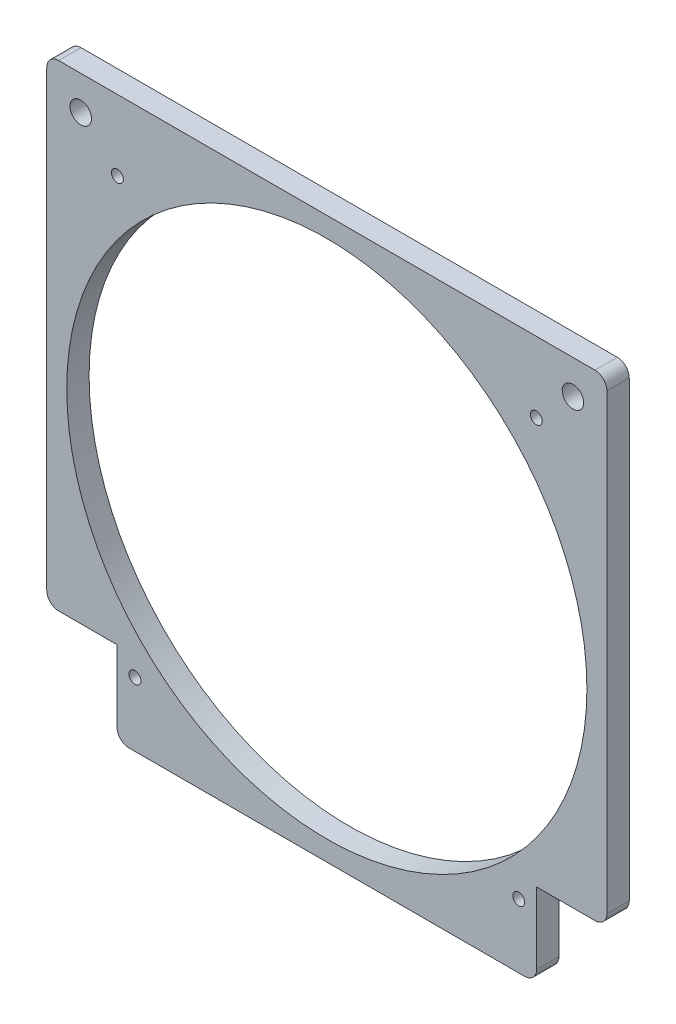
ISO-10303-21;
HEADER;
FILE_DESCRIPTION(('STEP AP214'),'2;1');
FILE_NAME('part.step','',(''),(''),'','','');
FILE_SCHEMA(('AUTOMOTIVE_DESIGN { 1 0 10303 214 1 1 1 1 }'));
ENDSEC;
DATA;
#1=APPLICATION_CONTEXT('core data for automotive mechanical design processes');
#2=APPLICATION_PROTOCOL_DEFINITION('international standard','automotive_design',2000,#1);
#3=PRODUCT_CONTEXT('',#1,'mechanical');
#4=PRODUCT('Part','Part','',(#3));
#5=PRODUCT_RELATED_PRODUCT_CATEGORY('part','',(#4));
#6=PRODUCT_DEFINITION_FORMATION('','',#4);
#7=PRODUCT_DEFINITION_CONTEXT('part definition',#1,'design');
#8=PRODUCT_DEFINITION('design','',#6,#7);
#9=PRODUCT_DEFINITION_SHAPE('','',#8);
#10=(LENGTH_UNIT() NAMED_UNIT(*) SI_UNIT(.MILLI.,.METRE.));
#11=(NAMED_UNIT(*) PLANE_ANGLE_UNIT() SI_UNIT($,.RADIAN.));
#12=(NAMED_UNIT(*) SI_UNIT($,.STERADIAN.) SOLID_ANGLE_UNIT());
#13=UNCERTAINTY_MEASURE_WITH_UNIT(LENGTH_MEASURE(1.E-05),#10,'distance_accuracy_value','');
#14=(GEOMETRIC_REPRESENTATION_CONTEXT(3) GLOBAL_UNCERTAINTY_ASSIGNED_CONTEXT((#13)) GLOBAL_UNIT_ASSIGNED_CONTEXT((#10,
#11,#12)) REPRESENTATION_CONTEXT('',''));
#15=CARTESIAN_POINT('',(0.,0.,0.));
#16=DIRECTION('',(0.,0.,1.));
#17=DIRECTION('',(1.,0.,0.));
#18=AXIS2_PLACEMENT_3D('',#15,#16,#17);
#19=CARTESIAN_POINT('',(28.4934280897298,92.739217791411,4.7625));
#20=DIRECTION('',(-1.,0.,0.));
#21=DIRECTION('',(0.,-1.,0.));
#22=AXIS2_PLACEMENT_3D('',#19,#20,#21);
#23=PLANE('',#22);
#24=DIRECTION('',(0.,1.,0.));
#25=VECTOR('',#24,1.);
#26=CARTESIAN_POINT('',(28.4934280897298,92.739217791411,4.7625));
#27=LINE('',#26,#25);
#28=CARTESIAN_POINT('',(28.4934280897298,-6.32078220858896,4.7625));
#29=VERTEX_POINT('',#28);
#30=CARTESIAN_POINT('',(28.4934280897298,90.199217791411,4.7625));
#31=VERTEX_POINT('',#30);
#32=EDGE_CURVE('E221',#29,#31,#27,.T.);
#33=ORIENTED_EDGE('',*,*,#32,.F.);
#34=DIRECTION('',(0.,0.,-1.));
#35=VECTOR('',#34,1.);
#36=CARTESIAN_POINT('',(28.4934280897298,-6.32078220858896,4.7625));
#37=LINE('',#36,#35);
#38=CARTESIAN_POINT('',(28.4934280897298,-6.32078220858896,0.));
#39=VERTEX_POINT('',#38);
#40=EDGE_CURVE('E282',#29,#39,#37,.T.);
#41=ORIENTED_EDGE('',*,*,#40,.T.);
#42=DIRECTION('',(0.,1.,0.));
#43=VECTOR('',#42,1.);
#44=CARTESIAN_POINT('',(28.4934280897298,92.739217791411,0.));
#45=LINE('',#44,#43);
#46=CARTESIAN_POINT('',(28.4934280897298,90.199217791411,0.));
#47=VERTEX_POINT('',#46);
#48=EDGE_CURVE('E218',#39,#47,#45,.T.);
#49=ORIENTED_EDGE('',*,*,#48,.T.);
#50=DIRECTION('',(0.,0.,-1.));
#51=VECTOR('',#50,1.);
#52=CARTESIAN_POINT('',(28.4934280897298,90.199217791411,4.7625));
#53=LINE('',#52,#51);
#54=EDGE_CURVE('E257',#47,#31,#53,.F.);
#55=ORIENTED_EDGE('',*,*,#54,.T.);
#56=EDGE_LOOP('',(#33,#41,#49,#55));
#57=FACE_BOUND('',#56,.T.);
#58=ADVANCED_FACE('F34',(#57),#23,.F.);
#59=CARTESIAN_POINT('',(-90.8865719102702,92.739217791411,4.7625));
#60=DIRECTION('',(0.,-1.,0.));
#61=DIRECTION('',(0.,0.,-1.));
#62=AXIS2_PLACEMENT_3D('',#59,#60,#61);
#63=PLANE('',#62);
#64=DIRECTION('',(-1.,0.,0.));
#65=VECTOR('',#64,1.);
#66=CARTESIAN_POINT('',(-90.8865719102702,92.739217791411,0.));
#67=LINE('',#66,#65);
#68=CARTESIAN_POINT('',(25.9534280897298,92.739217791411,0.));
#69=VERTEX_POINT('',#68);
#70=CARTESIAN_POINT('',(-88.3465719102702,92.739217791411,0.));
#71=VERTEX_POINT('',#70);
#72=EDGE_CURVE('E233',#69,#71,#67,.T.);
#73=ORIENTED_EDGE('',*,*,#72,.T.);
#74=DIRECTION('',(0.,0.,-1.));
#75=VECTOR('',#74,1.);
#76=CARTESIAN_POINT('',(-88.3465719102702,92.739217791411,4.7625));
#77=LINE('',#76,#75);
#78=CARTESIAN_POINT('',(-88.3465719102702,92.739217791411,4.7625));
#79=VERTEX_POINT('',#78);
#80=EDGE_CURVE('E251',#71,#79,#77,.F.);
#81=ORIENTED_EDGE('',*,*,#80,.T.);
#82=DIRECTION('',(-1.,0.,0.));
#83=VECTOR('',#82,1.);
#84=CARTESIAN_POINT('',(-90.8865719102702,92.739217791411,4.7625));
#85=LINE('',#84,#83);
#86=CARTESIAN_POINT('',(25.9534280897298,92.739217791411,4.7625));
#87=VERTEX_POINT('',#86);
#88=EDGE_CURVE('E223',#87,#79,#85,.T.);
#89=ORIENTED_EDGE('',*,*,#88,.F.);
#90=DIRECTION('',(0.,0.,-1.));
#91=VECTOR('',#90,1.);
#92=CARTESIAN_POINT('',(25.9534280897298,92.739217791411,4.7625));
#93=LINE('',#92,#91);
#94=EDGE_CURVE('E248',#87,#69,#93,.T.);
#95=ORIENTED_EDGE('',*,*,#94,.T.);
#96=EDGE_LOOP('',(#73,#81,#89,#95));
#97=FACE_BOUND('',#96,.T.);
#98=ADVANCED_FACE('F321',(#97),#63,.F.);
#99=CARTESIAN_POINT('',(-90.8865719102702,92.739217791411,4.7625));
#100=DIRECTION('',(1.,0.,0.));
#101=DIRECTION('',(0.,1.,0.));
#102=AXIS2_PLACEMENT_3D('',#99,#100,#101);
#103=PLANE('',#102);
#104=DIRECTION('',(0.,-1.,0.));
#105=VECTOR('',#104,1.);
#106=CARTESIAN_POINT('',(-90.8865719102702,92.739217791411,0.));
#107=LINE('',#106,#105);
#108=CARTESIAN_POINT('',(-90.8865719102702,90.199217791411,0.));
#109=VERTEX_POINT('',#108);
#110=CARTESIAN_POINT('',(-90.8865719102702,-6.32078220858896,0.));
#111=VERTEX_POINT('',#110);
#112=EDGE_CURVE('E236',#109,#111,#107,.T.);
#113=ORIENTED_EDGE('',*,*,#112,.T.);
#114=DIRECTION('',(0.,0.,-1.));
#115=VECTOR('',#114,1.);
#116=CARTESIAN_POINT('',(-90.8865719102702,-6.32078220858896,4.7625));
#117=LINE('',#116,#115);
#118=CARTESIAN_POINT('',(-90.8865719102702,-6.32078220858896,4.7625));
#119=VERTEX_POINT('',#118);
#120=EDGE_CURVE('E11',#111,#119,#117,.F.);
#121=ORIENTED_EDGE('',*,*,#120,.T.);
#122=DIRECTION('',(0.,-1.,0.));
#123=VECTOR('',#122,1.);
#124=CARTESIAN_POINT('',(-90.8865719102702,92.739217791411,4.7625));
#125=LINE('',#124,#123);
#126=CARTESIAN_POINT('',(-90.8865719102702,90.199217791411,4.7625));
#127=VERTEX_POINT('',#126);
#128=EDGE_CURVE('E227',#127,#119,#125,.T.);
#129=ORIENTED_EDGE('',*,*,#128,.F.);
#130=DIRECTION('',(0.,0.,-1.));
#131=VECTOR('',#130,1.);
#132=CARTESIAN_POINT('',(-90.8865719102702,90.199217791411,4.7625));
#133=LINE('',#132,#131);
#134=EDGE_CURVE('E231',#127,#109,#133,.T.);
#135=ORIENTED_EDGE('',*,*,#134,.T.);
#136=EDGE_LOOP('',(#113,#121,#129,#135));
#137=FACE_BOUND('',#136,.T.);
#138=ADVANCED_FACE('F330',(#137),#103,.F.);
#139=CARTESIAN_POINT('',(-90.8865719102702,-26.640782208589,4.7625));
#140=DIRECTION('',(0.,1.,0.));
#141=DIRECTION('',(0.,0.,1.));
#142=AXIS2_PLACEMENT_3D('',#139,#140,#141);
#143=PLANE('',#142);
#144=DIRECTION('',(1.,0.,0.));
#145=VECTOR('',#144,1.);
#146=CARTESIAN_POINT('',(-90.8865719102702,-26.640782208589,0.));
#147=LINE('',#146,#145);
#148=CARTESIAN_POINT('',(-73.3605719102702,-26.640782208589,0.));
#149=VERTEX_POINT('',#148);
#150=CARTESIAN_POINT('',(10.9674280897298,-26.640782208589,0.));
#151=VERTEX_POINT('',#150);
#152=EDGE_CURVE('E224',#149,#151,#147,.T.);
#153=ORIENTED_EDGE('',*,*,#152,.T.);
#154=DIRECTION('',(0.,0.,-1.));
#155=VECTOR('',#154,1.);
#156=CARTESIAN_POINT('',(10.9674280897298,-26.640782208589,4.7625));
#157=LINE('',#156,#155);
#158=CARTESIAN_POINT('',(10.9674280897298,-26.640782208589,4.7625));
#159=VERTEX_POINT('',#158);
#160=EDGE_CURVE('E274',#151,#159,#157,.F.);
#161=ORIENTED_EDGE('',*,*,#160,.T.);
#162=DIRECTION('',(1.,0.,0.));
#163=VECTOR('',#162,1.);
#164=CARTESIAN_POINT('',(-90.8865719102702,-26.640782208589,4.7625));
#165=LINE('',#164,#163);
#166=CARTESIAN_POINT('',(-73.3605719102702,-26.640782208589,4.7625));
#167=VERTEX_POINT('',#166);
#168=EDGE_CURVE('E229',#167,#159,#165,.T.);
#169=ORIENTED_EDGE('',*,*,#168,.F.);
#170=DIRECTION('',(0.,0.,-1.));
#171=VECTOR('',#170,1.);
#172=CARTESIAN_POINT('',(-73.3605719102702,-26.640782208589,4.7625));
#173=LINE('',#172,#171);
#174=EDGE_CURVE('E271',#167,#149,#173,.T.);
#175=ORIENTED_EDGE('',*,*,#174,.T.);
#176=EDGE_LOOP('',(#153,#161,#169,#175));
#177=FACE_BOUND('',#176,.T.);
#178=ADVANCED_FACE('F298',(#177),#143,.F.);
#179=CARTESIAN_POINT('',(0.,0.,4.7625));
#180=DIRECTION('',(0.,0.,1.));
#181=DIRECTION('',(1.,0.,0.));
#182=AXIS2_PLACEMENT_3D('',#179,#180,#181);
#183=PLANE('',#182);
#184=ORIENTED_EDGE('',*,*,#168,.T.);
#185=CARTESIAN_POINT('',(10.9674280897298,-24.100782208589,4.7625));
#186=DIRECTION('',(0.,0.,1.));
#187=DIRECTION('',(1.,0.,0.));
#188=AXIS2_PLACEMENT_3D('',#185,#186,#187);
#189=CIRCLE('',#188,2.54);
#190=CARTESIAN_POINT('',(13.5074280897298,-24.100782208589,4.7625));
#191=VERTEX_POINT('',#190);
#192=EDGE_CURVE('E280',#159,#191,#189,.T.);
#193=ORIENTED_EDGE('',*,*,#192,.T.);
#194=DIRECTION('',(0.,1.,0.));
#195=VECTOR('',#194,1.);
#196=CARTESIAN_POINT('',(13.5074280897298,-26.640782208589,4.7625));
#197=LINE('',#196,#195);
#198=CARTESIAN_POINT('',(13.5074280897298,-8.86078220858896,4.7625));
#199=VERTEX_POINT('',#198);
#200=EDGE_CURVE('E162',#191,#199,#197,.T.);
#201=ORIENTED_EDGE('',*,*,#200,.T.);
#202=DIRECTION('',(1.,0.,0.));
#203=VECTOR('',#202,1.);
#204=CARTESIAN_POINT('',(28.4934280897298,-8.86078220858896,4.7625));
#205=LINE('',#204,#203);
#206=CARTESIAN_POINT('',(25.9534280897298,-8.86078220858896,4.7625));
#207=VERTEX_POINT('',#206);
#208=EDGE_CURVE('E165',#199,#207,#205,.T.);
#209=ORIENTED_EDGE('',*,*,#208,.T.);
#210=CARTESIAN_POINT('',(25.9534280897298,-6.32078220858896,4.7625));
#211=DIRECTION('',(0.,0.,1.));
#212=DIRECTION('',(1.,0.,0.));
#213=AXIS2_PLACEMENT_3D('',#210,#211,#212);
#214=CIRCLE('',#213,2.54);
#215=EDGE_CURVE('E49',#207,#29,#214,.T.);
#216=ORIENTED_EDGE('',*,*,#215,.T.);
#217=ORIENTED_EDGE('',*,*,#32,.T.);
#218=CARTESIAN_POINT('',(25.9534280897298,90.199217791411,4.7625));
#219=DIRECTION('',(0.,0.,1.));
#220=DIRECTION('',(1.,0.,0.));
#221=AXIS2_PLACEMENT_3D('',#218,#219,#220);
#222=CIRCLE('',#221,2.54);
#223=EDGE_CURVE('E253',#31,#87,#222,.T.);
#224=ORIENTED_EDGE('',*,*,#223,.T.);
#225=ORIENTED_EDGE('',*,*,#88,.T.);
#226=CARTESIAN_POINT('',(-88.3465719102702,90.199217791411,4.7625));
#227=DIRECTION('',(0.,0.,1.));
#228=DIRECTION('',(1.,0.,0.));
#229=AXIS2_PLACEMENT_3D('',#226,#227,#228);
#230=CIRCLE('',#229,2.54);
#231=EDGE_CURVE('E255',#79,#127,#230,.T.);
#232=ORIENTED_EDGE('',*,*,#231,.T.);
#233=ORIENTED_EDGE('',*,*,#128,.T.);
#234=CARTESIAN_POINT('',(-88.3465719102702,-6.32078220858896,4.7625));
#235=DIRECTION('',(0.,0.,1.));
#236=DIRECTION('',(1.,0.,0.));
#237=AXIS2_PLACEMENT_3D('',#234,#235,#236);
#238=CIRCLE('',#237,2.54);
#239=CARTESIAN_POINT('',(-88.3465719102702,-8.86078220858896,4.7625));
#240=VERTEX_POINT('',#239);
#241=EDGE_CURVE('E144',#119,#240,#238,.T.);
#242=ORIENTED_EDGE('',*,*,#241,.T.);
#243=DIRECTION('',(1.,0.,0.));
#244=VECTOR('',#243,1.);
#245=CARTESIAN_POINT('',(-90.8865719102702,-8.86078220858896,4.7625));
#246=LINE('',#245,#244);
#247=CARTESIAN_POINT('',(-75.9005719102702,-8.86078220858896,4.7625));
#248=VERTEX_POINT('',#247);
#249=EDGE_CURVE('E135',#240,#248,#246,.T.);
#250=ORIENTED_EDGE('',*,*,#249,.T.);
#251=DIRECTION('',(0.,-1.,0.));
#252=VECTOR('',#251,1.);
#253=CARTESIAN_POINT('',(-75.9005719102702,-26.640782208589,4.7625));
#254=LINE('',#253,#252);
#255=CARTESIAN_POINT('',(-75.9005719102702,-24.100782208589,4.7625));
#256=VERTEX_POINT('',#255);
#257=EDGE_CURVE('E140',#248,#256,#254,.T.);
#258=ORIENTED_EDGE('',*,*,#257,.T.);
#259=CARTESIAN_POINT('',(-73.3605719102702,-24.100782208589,4.7625));
#260=DIRECTION('',(0.,0.,1.));
#261=DIRECTION('',(1.,0.,0.));
#262=AXIS2_PLACEMENT_3D('',#259,#260,#261);
#263=CIRCLE('',#262,2.54);
#264=EDGE_CURVE('E277',#256,#167,#263,.T.);
#265=ORIENTED_EDGE('',*,*,#264,.T.);
#266=EDGE_LOOP('',(#184,#193,#201,#209,#216,#217,#224,#225,#232,#233,#242,#250,#258,#265));
#267=FACE_BOUND('',#266,.T.);
#268=CARTESIAN_POINT('',(-72.0905719102702,-12.9882822085891,4.7625));
#269=DIRECTION('',(0.,0.,1.));
#270=DIRECTION('',(1.,0.,0.));
#271=AXIS2_PLACEMENT_3D('',#268,#269,#270);
#272=CIRCLE('',#271,1.27000000000001);
#273=CARTESIAN_POINT('',(-70.8205719102702,-12.9882822085891,4.7625));
#274=VERTEX_POINT('',#273);
#275=EDGE_CURVE('E178',#274,#274,#272,.F.);
#276=ORIENTED_EDGE('',*,*,#275,.T.);
#277=EDGE_LOOP('',(#276));
#278=FACE_BOUND('',#277,.T.);
#279=CARTESIAN_POINT('',(9.6974280897298,-12.9882822085891,4.7625));
#280=DIRECTION('',(0.,0.,1.));
#281=DIRECTION('',(1.,0.,0.));
#282=AXIS2_PLACEMENT_3D('',#279,#280,#281);
#283=CIRCLE('',#282,1.27);
#284=CARTESIAN_POINT('',(10.9674280897298,-12.9882822085891,4.7625));
#285=VERTEX_POINT('',#284);
#286=EDGE_CURVE('E189',#285,#285,#283,.F.);
#287=ORIENTED_EDGE('',*,*,#286,.T.);
#288=EDGE_LOOP('',(#287));
#289=FACE_BOUND('',#288,.T.);
#290=CARTESIAN_POINT('',(-75.8370719102702,77.689717791411,4.7625));
#291=DIRECTION('',(0.,0.,1.));
#292=DIRECTION('',(1.,0.,0.));
#293=AXIS2_PLACEMENT_3D('',#290,#291,#292);
#294=CIRCLE('',#293,1.26999999999999);
#295=CARTESIAN_POINT('',(-74.5670719102702,77.689717791411,4.7625));
#296=VERTEX_POINT('',#295);
#297=EDGE_CURVE('E183',#296,#296,#294,.F.);
#298=ORIENTED_EDGE('',*,*,#297,.T.);
#299=EDGE_LOOP('',(#298));
#300=FACE_BOUND('',#299,.T.);
#301=CARTESIAN_POINT('',(-83.6475719102702,85.500217791411,4.7625));
#302=DIRECTION('',(0.,0.,1.));
#303=DIRECTION('',(1.,0.,0.));
#304=AXIS2_PLACEMENT_3D('',#301,#302,#303);
#305=CIRCLE('',#304,2.28599999999999);
#306=CARTESIAN_POINT('',(-81.3615719102702,85.500217791411,4.7625));
#307=VERTEX_POINT('',#306);
#308=EDGE_CURVE('E206',#307,#307,#305,.F.);
#309=ORIENTED_EDGE('',*,*,#308,.T.);
#310=EDGE_LOOP('',(#309));
#311=FACE_BOUND('',#310,.T.);
#312=CARTESIAN_POINT('',(13.4439280897298,77.6897177914109,4.7625));
#313=DIRECTION('',(0.,0.,1.));
#314=DIRECTION('',(1.,0.,0.));
#315=AXIS2_PLACEMENT_3D('',#312,#313,#314);
#316=CIRCLE('',#315,1.27);
#317=CARTESIAN_POINT('',(14.7139280897298,77.6897177914109,4.7625));
#318=VERTEX_POINT('',#317);
#319=EDGE_CURVE('E182',#318,#318,#316,.F.);
#320=ORIENTED_EDGE('',*,*,#319,.T.);
#321=EDGE_LOOP('',(#320));
#322=FACE_BOUND('',#321,.T.);
#323=CARTESIAN_POINT('',(-31.1965719102702,33.049217791411,4.7625));
#324=DIRECTION('',(0.,0.,1.));
#325=DIRECTION('',(1.,0.,0.));
#326=AXIS2_PLACEMENT_3D('',#323,#324,#325);
#327=CIRCLE('',#326,55.4291226302911);
#328=CARTESIAN_POINT('',(24.2325507200209,33.049217791411,4.7625));
#329=VERTEX_POINT('',#328);
#330=EDGE_CURVE('E200',#329,#329,#327,.F.);
#331=ORIENTED_EDGE('',*,*,#330,.T.);
#332=EDGE_LOOP('',(#331));
#333=FACE_BOUND('',#332,.T.);
#334=CARTESIAN_POINT('',(21.2544280897298,85.500217791411,4.7625));
#335=DIRECTION('',(0.,0.,1.));
#336=DIRECTION('',(1.,0.,0.));
#337=AXIS2_PLACEMENT_3D('',#334,#335,#336);
#338=CIRCLE('',#337,2.286);
#339=CARTESIAN_POINT('',(23.5404280897298,85.500217791411,4.7625));
#340=VERTEX_POINT('',#339);
#341=EDGE_CURVE('E212',#340,#340,#338,.F.);
#342=ORIENTED_EDGE('',*,*,#341,.T.);
#343=EDGE_LOOP('',(#342));
#344=FACE_BOUND('',#343,.T.);
#345=ADVANCED_FACE('F138',(#267,#278,#289,#300,#311,#322,#333,#344),#183,.T.);
#346=CARTESIAN_POINT('',(0.,0.,0.));
#347=DIRECTION('',(0.,0.,1.));
#348=DIRECTION('',(1.,0.,0.));
#349=AXIS2_PLACEMENT_3D('',#346,#347,#348);
#350=PLANE('',#349);
#351=CARTESIAN_POINT('',(-72.0905719102702,-12.9882822085891,0.));
#352=DIRECTION('',(0.,0.,-1.));
#353=DIRECTION('',(1.,0.,0.));
#354=AXIS2_PLACEMENT_3D('',#351,#352,#353);
#355=CIRCLE('',#354,1.27000000000001);
#356=CARTESIAN_POINT('',(-70.8205719102702,-12.9882822085891,0.));
#357=VERTEX_POINT('',#356);
#358=EDGE_CURVE('E192',#357,#357,#355,.T.);
#359=ORIENTED_EDGE('',*,*,#358,.F.);
#360=EDGE_LOOP('',(#359));
#361=FACE_BOUND('',#360,.T.);
#362=CARTESIAN_POINT('',(9.6974280897298,-12.9882822085891,0.));
#363=DIRECTION('',(0.,0.,-1.));
#364=DIRECTION('',(-1.,0.,0.));
#365=AXIS2_PLACEMENT_3D('',#362,#363,#364);
#366=CIRCLE('',#365,1.27);
#367=CARTESIAN_POINT('',(8.4274280897298,-12.9882822085891,0.));
#368=VERTEX_POINT('',#367);
#369=EDGE_CURVE('E186',#368,#368,#366,.T.);
#370=ORIENTED_EDGE('',*,*,#369,.F.);
#371=EDGE_LOOP('',(#370));
#372=FACE_BOUND('',#371,.T.);
#373=CARTESIAN_POINT('',(-75.8370719102702,77.689717791411,0.));
#374=DIRECTION('',(0.,0.,-1.));
#375=DIRECTION('',(1.,0.,0.));
#376=AXIS2_PLACEMENT_3D('',#373,#374,#375);
#377=CIRCLE('',#376,1.26999999999999);
#378=CARTESIAN_POINT('',(-74.5670719102702,77.689717791411,0.));
#379=VERTEX_POINT('',#378);
#380=EDGE_CURVE('E179',#379,#379,#377,.T.);
#381=ORIENTED_EDGE('',*,*,#380,.F.);
#382=EDGE_LOOP('',(#381));
#383=FACE_BOUND('',#382,.T.);
#384=CARTESIAN_POINT('',(-83.6475719102702,85.500217791411,0.));
#385=DIRECTION('',(0.,0.,-1.));
#386=DIRECTION('',(-1.,0.,0.));
#387=AXIS2_PLACEMENT_3D('',#384,#385,#386);
#388=CIRCLE('',#387,2.28599999999999);
#389=CARTESIAN_POINT('',(-85.9335719102702,85.500217791411,0.));
#390=VERTEX_POINT('',#389);
#391=EDGE_CURVE('E209',#390,#390,#388,.T.);
#392=ORIENTED_EDGE('',*,*,#391,.F.);
#393=EDGE_LOOP('',(#392));
#394=FACE_BOUND('',#393,.T.);
#395=CARTESIAN_POINT('',(13.4439280897298,77.6897177914109,0.));
#396=DIRECTION('',(0.,0.,-1.));
#397=DIRECTION('',(-1.,0.,0.));
#398=AXIS2_PLACEMENT_3D('',#395,#396,#397);
#399=CIRCLE('',#398,1.27);
#400=CARTESIAN_POINT('',(12.1739280897298,77.6897177914109,0.));
#401=VERTEX_POINT('',#400);
#402=EDGE_CURVE('E197',#401,#401,#399,.T.);
#403=ORIENTED_EDGE('',*,*,#402,.F.);
#404=EDGE_LOOP('',(#403));
#405=FACE_BOUND('',#404,.T.);
#406=CARTESIAN_POINT('',(-31.1965719102702,33.049217791411,0.));
#407=DIRECTION('',(0.,0.,-1.));
#408=DIRECTION('',(-1.,0.,0.));
#409=AXIS2_PLACEMENT_3D('',#406,#407,#408);
#410=CIRCLE('',#409,55.4291226302911);
#411=CARTESIAN_POINT('',(-86.6256945405613,33.049217791411,0.));
#412=VERTEX_POINT('',#411);
#413=EDGE_CURVE('E203',#412,#412,#410,.T.);
#414=ORIENTED_EDGE('',*,*,#413,.F.);
#415=EDGE_LOOP('',(#414));
#416=FACE_BOUND('',#415,.T.);
#417=CARTESIAN_POINT('',(21.2544280897298,85.500217791411,0.));
#418=DIRECTION('',(0.,0.,-1.));
#419=DIRECTION('',(-1.,0.,0.));
#420=AXIS2_PLACEMENT_3D('',#417,#418,#419);
#421=CIRCLE('',#420,2.286);
#422=CARTESIAN_POINT('',(18.9684280897298,85.500217791411,0.));
#423=VERTEX_POINT('',#422);
#424=EDGE_CURVE('E215',#423,#423,#421,.T.);
#425=ORIENTED_EDGE('',*,*,#424,.F.);
#426=EDGE_LOOP('',(#425));
#427=FACE_BOUND('',#426,.T.);
#428=DIRECTION('',(0.,1.,0.));
#429=VECTOR('',#428,1.);
#430=CARTESIAN_POINT('',(13.5074280897298,-26.640782208589,0.));
#431=LINE('',#430,#429);
#432=CARTESIAN_POINT('',(13.5074280897298,-24.100782208589,0.));
#433=VERTEX_POINT('',#432);
#434=CARTESIAN_POINT('',(13.5074280897298,-8.86078220858896,0.));
#435=VERTEX_POINT('',#434);
#436=EDGE_CURVE('E171',#433,#435,#431,.T.);
#437=ORIENTED_EDGE('',*,*,#436,.F.);
#438=CARTESIAN_POINT('',(10.9674280897298,-24.100782208589,0.));
#439=DIRECTION('',(0.,0.,1.));
#440=DIRECTION('',(1.,0.,0.));
#441=AXIS2_PLACEMENT_3D('',#438,#439,#440);
#442=CIRCLE('',#441,2.54);
#443=EDGE_CURVE('E269',#433,#151,#442,.F.);
#444=ORIENTED_EDGE('',*,*,#443,.T.);
#445=ORIENTED_EDGE('',*,*,#152,.F.);
#446=CARTESIAN_POINT('',(-73.3605719102702,-24.100782208589,0.));
#447=DIRECTION('',(0.,0.,1.));
#448=DIRECTION('',(1.,0.,0.));
#449=AXIS2_PLACEMENT_3D('',#446,#447,#448);
#450=CIRCLE('',#449,2.54);
#451=CARTESIAN_POINT('',(-75.9005719102702,-24.100782208589,0.));
#452=VERTEX_POINT('',#451);
#453=EDGE_CURVE('E265',#149,#452,#450,.F.);
#454=ORIENTED_EDGE('',*,*,#453,.T.);
#455=DIRECTION('',(0.,-1.,0.));
#456=VECTOR('',#455,1.);
#457=CARTESIAN_POINT('',(-75.9005719102702,-26.640782208589,0.));
#458=LINE('',#457,#456);
#459=CARTESIAN_POINT('',(-75.9005719102702,-8.86078220858896,0.));
#460=VERTEX_POINT('',#459);
#461=EDGE_CURVE('E163',#460,#452,#458,.T.);
#462=ORIENTED_EDGE('',*,*,#461,.F.);
#463=DIRECTION('',(1.,0.,0.));
#464=VECTOR('',#463,1.);
#465=CARTESIAN_POINT('',(-90.8865719102702,-8.86078220858896,0.));
#466=LINE('',#465,#464);
#467=CARTESIAN_POINT('',(-88.3465719102702,-8.86078220858896,0.));
#468=VERTEX_POINT('',#467);
#469=EDGE_CURVE('E158',#468,#460,#466,.T.);
#470=ORIENTED_EDGE('',*,*,#469,.F.);
#471=CARTESIAN_POINT('',(-88.3465719102702,-6.32078220858896,0.));
#472=DIRECTION('',(0.,0.,1.));
#473=DIRECTION('',(1.,0.,0.));
#474=AXIS2_PLACEMENT_3D('',#471,#472,#473);
#475=CIRCLE('',#474,2.54);
#476=EDGE_CURVE('E263',#468,#111,#475,.F.);
#477=ORIENTED_EDGE('',*,*,#476,.T.);
#478=ORIENTED_EDGE('',*,*,#112,.F.);
#479=CARTESIAN_POINT('',(-88.3465719102702,90.199217791411,0.));
#480=DIRECTION('',(0.,0.,1.));
#481=DIRECTION('',(1.,0.,0.));
#482=AXIS2_PLACEMENT_3D('',#479,#480,#481);
#483=CIRCLE('',#482,2.54);
#484=EDGE_CURVE('E246',#109,#71,#483,.F.);
#485=ORIENTED_EDGE('',*,*,#484,.T.);
#486=ORIENTED_EDGE('',*,*,#72,.F.);
#487=CARTESIAN_POINT('',(25.9534280897298,90.199217791411,0.));
#488=DIRECTION('',(0.,0.,1.));
#489=DIRECTION('',(1.,0.,0.));
#490=AXIS2_PLACEMENT_3D('',#487,#488,#489);
#491=CIRCLE('',#490,2.54);
#492=EDGE_CURVE('E243',#69,#47,#491,.F.);
#493=ORIENTED_EDGE('',*,*,#492,.T.);
#494=ORIENTED_EDGE('',*,*,#48,.F.);
#495=CARTESIAN_POINT('',(25.9534280897298,-6.32078220858896,0.));
#496=DIRECTION('',(0.,0.,1.));
#497=DIRECTION('',(1.,0.,0.));
#498=AXIS2_PLACEMENT_3D('',#495,#496,#497);
#499=CIRCLE('',#498,2.54);
#500=CARTESIAN_POINT('',(25.9534280897298,-8.86078220858896,0.));
#501=VERTEX_POINT('',#500);
#502=EDGE_CURVE('E267',#39,#501,#499,.F.);
#503=ORIENTED_EDGE('',*,*,#502,.T.);
#504=DIRECTION('',(1.,0.,0.));
#505=VECTOR('',#504,1.);
#506=CARTESIAN_POINT('',(28.4934280897298,-8.86078220858896,0.));
#507=LINE('',#506,#505);
#508=EDGE_CURVE('E173',#435,#501,#507,.T.);
#509=ORIENTED_EDGE('',*,*,#508,.F.);
#510=EDGE_LOOP('',(#437,#444,#445,#454,#462,#470,#477,#478,#485,#486,#493,#494,#503,#509));
#511=FACE_BOUND('',#510,.T.);
#512=ADVANCED_FACE('F289',(#361,#372,#383,#394,#405,#416,#427,#511),#350,.F.);
#513=CARTESIAN_POINT('',(21.2544280897298,85.500217791411,4.7635));
#514=DIRECTION('',(0.,0.,-1.));
#515=DIRECTION('',(-1.,0.,0.));
#516=AXIS2_PLACEMENT_3D('',#513,#514,#515);
#517=CYLINDRICAL_SURFACE('',#516,2.286);
#518=ORIENTED_EDGE('',*,*,#341,.F.);
#519=EDGE_LOOP('',(#518));
#520=FACE_BOUND('',#519,.T.);
#521=ORIENTED_EDGE('',*,*,#424,.T.);
#522=EDGE_LOOP('',(#521));
#523=FACE_BOUND('',#522,.T.);
#524=ADVANCED_FACE('F400',(#520,#523),#517,.F.);
#525=CARTESIAN_POINT('',(-31.1965719102702,33.049217791411,4.7635));
#526=DIRECTION('',(0.,0.,-1.));
#527=DIRECTION('',(-1.,0.,0.));
#528=AXIS2_PLACEMENT_3D('',#525,#526,#527);
#529=CYLINDRICAL_SURFACE('',#528,55.4291226302911);
#530=ORIENTED_EDGE('',*,*,#330,.F.);
#531=EDGE_LOOP('',(#530));
#532=FACE_BOUND('',#531,.T.);
#533=ORIENTED_EDGE('',*,*,#413,.T.);
#534=EDGE_LOOP('',(#533));
#535=FACE_BOUND('',#534,.T.);
#536=ADVANCED_FACE('F529',(#532,#535),#529,.F.);
#537=CARTESIAN_POINT('',(13.4439280897298,77.6897177914109,4.7635));
#538=DIRECTION('',(0.,0.,-1.));
#539=DIRECTION('',(-1.,0.,0.));
#540=AXIS2_PLACEMENT_3D('',#537,#538,#539);
#541=CYLINDRICAL_SURFACE('',#540,1.27);
#542=ORIENTED_EDGE('',*,*,#319,.F.);
#543=EDGE_LOOP('',(#542));
#544=FACE_BOUND('',#543,.T.);
#545=ORIENTED_EDGE('',*,*,#402,.T.);
#546=EDGE_LOOP('',(#545));
#547=FACE_BOUND('',#546,.T.);
#548=ADVANCED_FACE('F519',(#544,#547),#541,.F.);
#549=CARTESIAN_POINT('',(-83.6475719102702,85.500217791411,4.7635));
#550=DIRECTION('',(0.,0.,-1.));
#551=DIRECTION('',(-1.,0.,0.));
#552=AXIS2_PLACEMENT_3D('',#549,#550,#551);
#553=CYLINDRICAL_SURFACE('',#552,2.28599999999999);
#554=ORIENTED_EDGE('',*,*,#308,.F.);
#555=EDGE_LOOP('',(#554));
#556=FACE_BOUND('',#555,.T.);
#557=ORIENTED_EDGE('',*,*,#391,.T.);
#558=EDGE_LOOP('',(#557));
#559=FACE_BOUND('',#558,.T.);
#560=ADVANCED_FACE('F509',(#556,#559),#553,.F.);
#561=CARTESIAN_POINT('',(-75.8370719102702,77.689717791411,4.7635));
#562=DIRECTION('',(0.,0.,-1.));
#563=DIRECTION('',(-1.,0.,0.));
#564=AXIS2_PLACEMENT_3D('',#561,#562,#563);
#565=CYLINDRICAL_SURFACE('',#564,1.26999999999999);
#566=ORIENTED_EDGE('',*,*,#297,.F.);
#567=EDGE_LOOP('',(#566));
#568=FACE_BOUND('',#567,.T.);
#569=ORIENTED_EDGE('',*,*,#380,.T.);
#570=EDGE_LOOP('',(#569));
#571=FACE_BOUND('',#570,.T.);
#572=ADVANCED_FACE('F499',(#568,#571),#565,.F.);
#573=CARTESIAN_POINT('',(9.6974280897298,-12.9882822085891,4.7635));
#574=DIRECTION('',(0.,0.,-1.));
#575=DIRECTION('',(-1.,0.,0.));
#576=AXIS2_PLACEMENT_3D('',#573,#574,#575);
#577=CYLINDRICAL_SURFACE('',#576,1.27);
#578=ORIENTED_EDGE('',*,*,#286,.F.);
#579=EDGE_LOOP('',(#578));
#580=FACE_BOUND('',#579,.T.);
#581=ORIENTED_EDGE('',*,*,#369,.T.);
#582=EDGE_LOOP('',(#581));
#583=FACE_BOUND('',#582,.T.);
#584=ADVANCED_FACE('F489',(#580,#583),#577,.F.);
#585=CARTESIAN_POINT('',(-72.0905719102702,-12.9882822085891,4.7635));
#586=DIRECTION('',(0.,0.,-1.));
#587=DIRECTION('',(-1.,0.,0.));
#588=AXIS2_PLACEMENT_3D('',#585,#586,#587);
#589=CYLINDRICAL_SURFACE('',#588,1.27000000000001);
#590=ORIENTED_EDGE('',*,*,#275,.F.);
#591=EDGE_LOOP('',(#590));
#592=FACE_BOUND('',#591,.T.);
#593=ORIENTED_EDGE('',*,*,#358,.T.);
#594=EDGE_LOOP('',(#593));
#595=FACE_BOUND('',#594,.T.);
#596=ADVANCED_FACE('F411',(#592,#595),#589,.F.);
#597=CARTESIAN_POINT('',(28.4934280897298,-8.86078220858896,4.7635));
#598=DIRECTION('',(0.,1.,0.));
#599=DIRECTION('',(0.,0.,1.));
#600=AXIS2_PLACEMENT_3D('',#597,#598,#599);
#601=PLANE('',#600);
#602=ORIENTED_EDGE('',*,*,#508,.T.);
#603=DIRECTION('',(0.,0.,-1.));
#604=VECTOR('',#603,1.);
#605=CARTESIAN_POINT('',(25.9534280897298,-8.86078220858896,4.7635));
#606=LINE('',#605,#604);
#607=EDGE_CURVE('E57',#501,#207,#606,.F.);
#608=ORIENTED_EDGE('',*,*,#607,.T.);
#609=ORIENTED_EDGE('',*,*,#208,.F.);
#610=DIRECTION('',(0.,0.,-1.));
#611=VECTOR('',#610,1.);
#612=CARTESIAN_POINT('',(13.5074280897298,-8.86078220858896,4.7635));
#613=LINE('',#612,#611);
#614=EDGE_CURVE('E175',#199,#435,#613,.T.);
#615=ORIENTED_EDGE('',*,*,#614,.T.);
#616=EDGE_LOOP('',(#602,#608,#609,#615));
#617=FACE_BOUND('',#616,.T.);
#618=ADVANCED_FACE('F308',(#617),#601,.F.);
#619=CARTESIAN_POINT('',(13.5074280897298,-26.640782208589,4.7635));
#620=DIRECTION('',(-1.,0.,0.));
#621=DIRECTION('',(0.,0.,1.));
#622=AXIS2_PLACEMENT_3D('',#619,#620,#621);
#623=PLANE('',#622);
#624=ORIENTED_EDGE('',*,*,#200,.F.);
#625=DIRECTION('',(0.,0.,-1.));
#626=VECTOR('',#625,1.);
#627=CARTESIAN_POINT('',(13.5074280897298,-24.100782208589,4.7635));
#628=LINE('',#627,#626);
#629=EDGE_CURVE('E260',#191,#433,#628,.T.);
#630=ORIENTED_EDGE('',*,*,#629,.T.);
#631=ORIENTED_EDGE('',*,*,#436,.T.);
#632=ORIENTED_EDGE('',*,*,#614,.F.);
#633=EDGE_LOOP('',(#624,#630,#631,#632));
#634=FACE_BOUND('',#633,.T.);
#635=ADVANCED_FACE('F306',(#634),#623,.F.);
#636=CARTESIAN_POINT('',(-75.9005719102702,-26.640782208589,4.7635));
#637=DIRECTION('',(1.,0.,0.));
#638=DIRECTION('',(0.,1.,0.));
#639=AXIS2_PLACEMENT_3D('',#636,#637,#638);
#640=PLANE('',#639);
#641=ORIENTED_EDGE('',*,*,#461,.T.);
#642=DIRECTION('',(0.,0.,-1.));
#643=VECTOR('',#642,1.);
#644=CARTESIAN_POINT('',(-75.9005719102702,-24.100782208589,4.7635));
#645=LINE('',#644,#643);
#646=EDGE_CURVE('E157',#452,#256,#645,.F.);
#647=ORIENTED_EDGE('',*,*,#646,.T.);
#648=ORIENTED_EDGE('',*,*,#257,.F.);
#649=DIRECTION('',(0.,0.,-1.));
#650=VECTOR('',#649,1.);
#651=CARTESIAN_POINT('',(-75.9005719102702,-8.86078220858896,4.7635));
#652=LINE('',#651,#650);
#653=EDGE_CURVE('E154',#248,#460,#652,.T.);
#654=ORIENTED_EDGE('',*,*,#653,.T.);
#655=EDGE_LOOP('',(#641,#647,#648,#654));
#656=FACE_BOUND('',#655,.T.);
#657=ADVANCED_FACE('F153',(#656),#640,.F.);
#658=CARTESIAN_POINT('',(-90.8865719102702,-8.86078220858896,4.7635));
#659=DIRECTION('',(0.,1.,0.));
#660=DIRECTION('',(0.,0.,1.));
#661=AXIS2_PLACEMENT_3D('',#658,#659,#660);
#662=PLANE('',#661);
#663=ORIENTED_EDGE('',*,*,#249,.F.);
#664=DIRECTION('',(0.,0.,-1.));
#665=VECTOR('',#664,1.);
#666=CARTESIAN_POINT('',(-88.3465719102702,-8.86078220858896,4.7635));
#667=LINE('',#666,#665);
#668=EDGE_CURVE('E42',#240,#468,#667,.T.);
#669=ORIENTED_EDGE('',*,*,#668,.T.);
#670=ORIENTED_EDGE('',*,*,#469,.T.);
#671=ORIENTED_EDGE('',*,*,#653,.F.);
#672=EDGE_LOOP('',(#663,#669,#670,#671));
#673=FACE_BOUND('',#672,.T.);
#674=ADVANCED_FACE('F160',(#673),#662,.F.);
#675=CARTESIAN_POINT('',(-88.3465719102702,90.199217791411,4.7625));
#676=DIRECTION('',(0.,0.,-1.));
#677=DIRECTION('',(-1.,0.,0.));
#678=AXIS2_PLACEMENT_3D('',#675,#676,#677);
#679=CYLINDRICAL_SURFACE('',#678,2.54);
#680=ORIENTED_EDGE('',*,*,#231,.F.);
#681=ORIENTED_EDGE('',*,*,#80,.F.);
#682=ORIENTED_EDGE('',*,*,#484,.F.);
#683=ORIENTED_EDGE('',*,*,#134,.F.);
#684=EDGE_LOOP('',(#680,#681,#682,#683));
#685=FACE_BOUND('',#684,.T.);
#686=ADVANCED_FACE('F326',(#685),#679,.T.);
#687=CARTESIAN_POINT('',(25.9534280897298,90.199217791411,4.7625));
#688=DIRECTION('',(0.,0.,-1.));
#689=DIRECTION('',(-1.,0.,0.));
#690=AXIS2_PLACEMENT_3D('',#687,#688,#689);
#691=CYLINDRICAL_SURFACE('',#690,2.54);
#692=ORIENTED_EDGE('',*,*,#223,.F.);
#693=ORIENTED_EDGE('',*,*,#54,.F.);
#694=ORIENTED_EDGE('',*,*,#492,.F.);
#695=ORIENTED_EDGE('',*,*,#94,.F.);
#696=EDGE_LOOP('',(#692,#693,#694,#695));
#697=FACE_BOUND('',#696,.T.);
#698=ADVANCED_FACE('F324',(#697),#691,.T.);
#699=CARTESIAN_POINT('',(10.9674280897298,-24.100782208589,4.7635));
#700=DIRECTION('',(0.,0.,-1.));
#701=DIRECTION('',(-1.,0.,0.));
#702=AXIS2_PLACEMENT_3D('',#699,#700,#701);
#703=CYLINDRICAL_SURFACE('',#702,2.54);
#704=ORIENTED_EDGE('',*,*,#192,.F.);
#705=ORIENTED_EDGE('',*,*,#160,.F.);
#706=ORIENTED_EDGE('',*,*,#443,.F.);
#707=ORIENTED_EDGE('',*,*,#629,.F.);
#708=EDGE_LOOP('',(#704,#705,#706,#707));
#709=FACE_BOUND('',#708,.T.);
#710=ADVANCED_FACE('F301',(#709),#703,.T.);
#711=CARTESIAN_POINT('',(25.9534280897298,-6.32078220858896,4.7625));
#712=DIRECTION('',(0.,0.,-1.));
#713=DIRECTION('',(-1.,0.,0.));
#714=AXIS2_PLACEMENT_3D('',#711,#712,#713);
#715=CYLINDRICAL_SURFACE('',#714,2.54);
#716=ORIENTED_EDGE('',*,*,#215,.F.);
#717=ORIENTED_EDGE('',*,*,#607,.F.);
#718=ORIENTED_EDGE('',*,*,#502,.F.);
#719=ORIENTED_EDGE('',*,*,#40,.F.);
#720=EDGE_LOOP('',(#716,#717,#718,#719));
#721=FACE_BOUND('',#720,.T.);
#722=ADVANCED_FACE('F312',(#721),#715,.T.);
#723=CARTESIAN_POINT('',(-73.3605719102702,-24.100782208589,4.7625));
#724=DIRECTION('',(0.,0.,-1.));
#725=DIRECTION('',(-1.,0.,0.));
#726=AXIS2_PLACEMENT_3D('',#723,#724,#725);
#727=CYLINDRICAL_SURFACE('',#726,2.54);
#728=ORIENTED_EDGE('',*,*,#264,.F.);
#729=ORIENTED_EDGE('',*,*,#646,.F.);
#730=ORIENTED_EDGE('',*,*,#453,.F.);
#731=ORIENTED_EDGE('',*,*,#174,.F.);
#732=EDGE_LOOP('',(#728,#729,#730,#731));
#733=FACE_BOUND('',#732,.T.);
#734=ADVANCED_FACE('F293',(#733),#727,.T.);
#735=CARTESIAN_POINT('',(-88.3465719102702,-6.32078220858896,4.7635));
#736=DIRECTION('',(0.,0.,-1.));
#737=DIRECTION('',(-1.,0.,0.));
#738=AXIS2_PLACEMENT_3D('',#735,#736,#737);
#739=CYLINDRICAL_SURFACE('',#738,2.54);
#740=ORIENTED_EDGE('',*,*,#241,.F.);
#741=ORIENTED_EDGE('',*,*,#120,.F.);
#742=ORIENTED_EDGE('',*,*,#476,.F.);
#743=ORIENTED_EDGE('',*,*,#668,.F.);
#744=EDGE_LOOP('',(#740,#741,#742,#743));
#745=FACE_BOUND('',#744,.T.);
#746=ADVANCED_FACE('F36',(#745),#739,.T.);
#747=CLOSED_SHELL('',(#58,#98,#138,#178,#345,#512,#524,#536,#548,#560,#572,#584,#596,#618,#635,
#657,#674,#686,#698,#710,#722,#734,#746));
#748=MANIFOLD_SOLID_BREP('B2',#747);
#749=ADVANCED_BREP_SHAPE_REPRESENTATION('',(#18,#748),#14);
#750=SHAPE_DEFINITION_REPRESENTATION(#9,#749);
ENDSEC;
END-ISO-10303-21;
